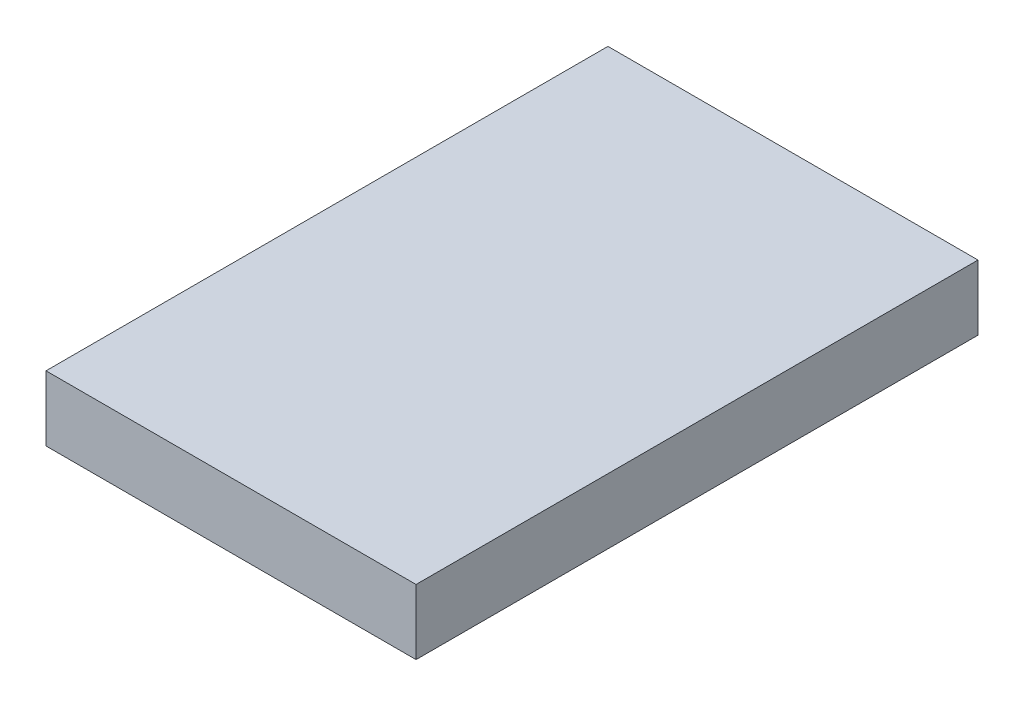
ISO-10303-21;
HEADER;
FILE_DESCRIPTION(('STEP AP214'),'2;1');
FILE_NAME('part.step','',(''),(''),'','','');
FILE_SCHEMA(('AUTOMOTIVE_DESIGN { 1 0 10303 214 1 1 1 1 }'));
ENDSEC;
DATA;
#1=APPLICATION_CONTEXT('core data for automotive mechanical design processes');
#2=APPLICATION_PROTOCOL_DEFINITION('international standard','automotive_design',2000,#1);
#3=PRODUCT_CONTEXT('',#1,'mechanical');
#4=PRODUCT('Part','Part','',(#3));
#5=PRODUCT_RELATED_PRODUCT_CATEGORY('part','',(#4));
#6=PRODUCT_DEFINITION_FORMATION('','',#4);
#7=PRODUCT_DEFINITION_CONTEXT('part definition',#1,'design');
#8=PRODUCT_DEFINITION('design','',#6,#7);
#9=PRODUCT_DEFINITION_SHAPE('','',#8);
#10=(LENGTH_UNIT() NAMED_UNIT(*) SI_UNIT(.MILLI.,.METRE.));
#11=(NAMED_UNIT(*) PLANE_ANGLE_UNIT() SI_UNIT($,.RADIAN.));
#12=(NAMED_UNIT(*) SI_UNIT($,.STERADIAN.) SOLID_ANGLE_UNIT());
#13=UNCERTAINTY_MEASURE_WITH_UNIT(LENGTH_MEASURE(1.E-05),#10,'distance_accuracy_value','');
#14=(GEOMETRIC_REPRESENTATION_CONTEXT(3) GLOBAL_UNCERTAINTY_ASSIGNED_CONTEXT((#13)) GLOBAL_UNIT_ASSIGNED_CONTEXT((#10,
#11,#12)) REPRESENTATION_CONTEXT('',''));
#15=CARTESIAN_POINT('',(0.,0.,0.));
#16=DIRECTION('',(0.,0.,1.));
#17=DIRECTION('',(1.,0.,0.));
#18=AXIS2_PLACEMENT_3D('',#15,#16,#17);
#19=CARTESIAN_POINT('',(27.,9.5,-41.));
#20=DIRECTION('',(-1.,0.,0.));
#21=DIRECTION('',(0.,0.,1.));
#22=AXIS2_PLACEMENT_3D('',#19,#20,#21);
#23=PLANE('',#22);
#24=DIRECTION('',(0.,0.,-1.));
#25=VECTOR('',#24,1.);
#26=CARTESIAN_POINT('',(27.,0.,-41.));
#27=LINE('',#26,#25);
#28=CARTESIAN_POINT('',(27.,0.,41.));
#29=VERTEX_POINT('',#28);
#30=CARTESIAN_POINT('',(27.,0.,-41.));
#31=VERTEX_POINT('',#30);
#32=EDGE_CURVE('E113',#29,#31,#27,.T.);
#33=ORIENTED_EDGE('',*,*,#32,.T.);
#34=DIRECTION('',(0.,-1.,0.));
#35=VECTOR('',#34,1.);
#36=CARTESIAN_POINT('',(27.,9.5,-41.));
#37=LINE('',#36,#35);
#38=CARTESIAN_POINT('',(27.,9.5,-41.));
#39=VERTEX_POINT('',#38);
#40=EDGE_CURVE('E11',#39,#31,#37,.T.);
#41=ORIENTED_EDGE('',*,*,#40,.F.);
#42=DIRECTION('',(0.,0.,-1.));
#43=VECTOR('',#42,1.);
#44=CARTESIAN_POINT('',(27.,9.5,-41.));
#45=LINE('',#44,#43);
#46=CARTESIAN_POINT('',(27.,9.5,41.));
#47=VERTEX_POINT('',#46);
#48=EDGE_CURVE('E97',#47,#39,#45,.T.);
#49=ORIENTED_EDGE('',*,*,#48,.F.);
#50=DIRECTION('',(0.,-1.,0.));
#51=VECTOR('',#50,1.);
#52=CARTESIAN_POINT('',(27.,9.5,41.));
#53=LINE('',#52,#51);
#54=EDGE_CURVE('E109',#47,#29,#53,.T.);
#55=ORIENTED_EDGE('',*,*,#54,.T.);
#56=EDGE_LOOP('',(#33,#41,#49,#55));
#57=FACE_BOUND('',#56,.T.);
#58=ADVANCED_FACE('F45',(#57),#23,.F.);
#59=CARTESIAN_POINT('',(-27.,9.5,-41.));
#60=DIRECTION('',(0.,0.,1.));
#61=DIRECTION('',(1.,0.,0.));
#62=AXIS2_PLACEMENT_3D('',#59,#60,#61);
#63=PLANE('',#62);
#64=DIRECTION('',(-1.,0.,0.));
#65=VECTOR('',#64,1.);
#66=CARTESIAN_POINT('',(-27.,0.,-41.));
#67=LINE('',#66,#65);
#68=CARTESIAN_POINT('',(-27.,0.,-41.));
#69=VERTEX_POINT('',#68);
#70=EDGE_CURVE('E102',#31,#69,#67,.T.);
#71=ORIENTED_EDGE('',*,*,#70,.T.);
#72=DIRECTION('',(0.,-1.,0.));
#73=VECTOR('',#72,1.);
#74=CARTESIAN_POINT('',(-27.,9.5,-41.));
#75=LINE('',#74,#73);
#76=CARTESIAN_POINT('',(-27.,9.5,-41.));
#77=VERTEX_POINT('',#76);
#78=EDGE_CURVE('E54',#77,#69,#75,.T.);
#79=ORIENTED_EDGE('',*,*,#78,.F.);
#80=DIRECTION('',(-1.,0.,0.));
#81=VECTOR('',#80,1.);
#82=CARTESIAN_POINT('',(-27.,9.5,-41.));
#83=LINE('',#82,#81);
#84=EDGE_CURVE('E92',#39,#77,#83,.T.);
#85=ORIENTED_EDGE('',*,*,#84,.F.);
#86=ORIENTED_EDGE('',*,*,#40,.T.);
#87=EDGE_LOOP('',(#71,#79,#85,#86));
#88=FACE_BOUND('',#87,.T.);
#89=ADVANCED_FACE('F101',(#88),#63,.F.);
#90=CARTESIAN_POINT('',(-27.,9.5,-41.));
#91=DIRECTION('',(1.,0.,0.));
#92=DIRECTION('',(0.,0.,-1.));
#93=AXIS2_PLACEMENT_3D('',#90,#91,#92);
#94=PLANE('',#93);
#95=DIRECTION('',(0.,0.,1.));
#96=VECTOR('',#95,1.);
#97=CARTESIAN_POINT('',(-27.,0.,-41.));
#98=LINE('',#97,#96);
#99=CARTESIAN_POINT('',(-27.,0.,41.));
#100=VERTEX_POINT('',#99);
#101=EDGE_CURVE('E79',#69,#100,#98,.T.);
#102=ORIENTED_EDGE('',*,*,#101,.T.);
#103=DIRECTION('',(0.,-1.,0.));
#104=VECTOR('',#103,1.);
#105=CARTESIAN_POINT('',(-27.,9.5,41.));
#106=LINE('',#105,#104);
#107=CARTESIAN_POINT('',(-27.,9.5,41.));
#108=VERTEX_POINT('',#107);
#109=EDGE_CURVE('E104',#108,#100,#106,.T.);
#110=ORIENTED_EDGE('',*,*,#109,.F.);
#111=DIRECTION('',(0.,0.,1.));
#112=VECTOR('',#111,1.);
#113=CARTESIAN_POINT('',(-27.,9.5,-41.));
#114=LINE('',#113,#112);
#115=EDGE_CURVE('E95',#77,#108,#114,.T.);
#116=ORIENTED_EDGE('',*,*,#115,.F.);
#117=ORIENTED_EDGE('',*,*,#78,.T.);
#118=EDGE_LOOP('',(#102,#110,#116,#117));
#119=FACE_BOUND('',#118,.T.);
#120=ADVANCED_FACE('F105',(#119),#94,.F.);
#121=CARTESIAN_POINT('',(-27.,9.5,41.));
#122=DIRECTION('',(0.,0.,-1.));
#123=DIRECTION('',(-1.,0.,0.));
#124=AXIS2_PLACEMENT_3D('',#121,#122,#123);
#125=PLANE('',#124);
#126=DIRECTION('',(1.,0.,0.));
#127=VECTOR('',#126,1.);
#128=CARTESIAN_POINT('',(-27.,0.,41.));
#129=LINE('',#128,#127);
#130=EDGE_CURVE('E85',#100,#29,#129,.T.);
#131=ORIENTED_EDGE('',*,*,#130,.T.);
#132=ORIENTED_EDGE('',*,*,#54,.F.);
#133=DIRECTION('',(1.,0.,0.));
#134=VECTOR('',#133,1.);
#135=CARTESIAN_POINT('',(-27.,9.5,41.));
#136=LINE('',#135,#134);
#137=EDGE_CURVE('E62',#108,#47,#136,.T.);
#138=ORIENTED_EDGE('',*,*,#137,.F.);
#139=ORIENTED_EDGE('',*,*,#109,.T.);
#140=EDGE_LOOP('',(#131,#132,#138,#139));
#141=FACE_BOUND('',#140,.T.);
#142=ADVANCED_FACE('F126',(#141),#125,.F.);
#143=CARTESIAN_POINT('',(0.,9.5,0.));
#144=DIRECTION('',(0.,1.,0.));
#145=DIRECTION('',(0.,0.,1.));
#146=AXIS2_PLACEMENT_3D('',#143,#144,#145);
#147=PLANE('',#146);
#148=ORIENTED_EDGE('',*,*,#48,.T.);
#149=ORIENTED_EDGE('',*,*,#84,.T.);
#150=ORIENTED_EDGE('',*,*,#115,.T.);
#151=ORIENTED_EDGE('',*,*,#137,.T.);
#152=EDGE_LOOP('',(#148,#149,#150,#151));
#153=FACE_BOUND('',#152,.T.);
#154=ADVANCED_FACE('F93',(#153),#147,.T.);
#155=CARTESIAN_POINT('',(0.,0.,0.));
#156=DIRECTION('',(0.,1.,0.));
#157=DIRECTION('',(0.,0.,1.));
#158=AXIS2_PLACEMENT_3D('',#155,#156,#157);
#159=PLANE('',#158);
#160=ORIENTED_EDGE('',*,*,#32,.F.);
#161=ORIENTED_EDGE('',*,*,#130,.F.);
#162=ORIENTED_EDGE('',*,*,#101,.F.);
#163=ORIENTED_EDGE('',*,*,#70,.F.);
#164=EDGE_LOOP('',(#160,#161,#162,#163));
#165=FACE_BOUND('',#164,.T.);
#166=ADVANCED_FACE('F129',(#165),#159,.F.);
#167=CLOSED_SHELL('',(#58,#89,#120,#142,#154,#166));
#168=MANIFOLD_SOLID_BREP('B2',#167);
#169=ADVANCED_BREP_SHAPE_REPRESENTATION('',(#18,#168),#14);
#170=SHAPE_DEFINITION_REPRESENTATION(#9,#169);
ENDSEC;
END-ISO-10303-21;
